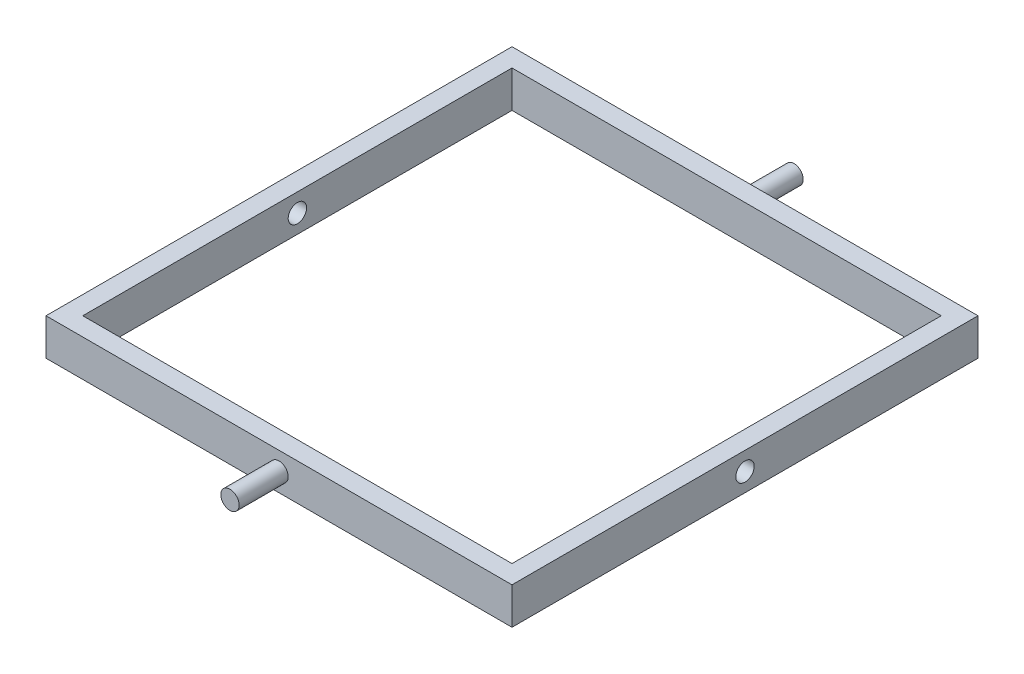
ISO-10303-21;
HEADER;
FILE_DESCRIPTION(('STEP AP214'),'2;1');
FILE_NAME('part.step','',(''),(''),'','','');
FILE_SCHEMA(('AUTOMOTIVE_DESIGN { 1 0 10303 214 1 1 1 1 }'));
ENDSEC;
DATA;
#1=APPLICATION_CONTEXT('core data for automotive mechanical design processes');
#2=APPLICATION_PROTOCOL_DEFINITION('international standard','automotive_design',2000,#1);
#3=PRODUCT_CONTEXT('',#1,'mechanical');
#4=PRODUCT('Part','Part','',(#3));
#5=PRODUCT_RELATED_PRODUCT_CATEGORY('part','',(#4));
#6=PRODUCT_DEFINITION_FORMATION('','',#4);
#7=PRODUCT_DEFINITION_CONTEXT('part definition',#1,'design');
#8=PRODUCT_DEFINITION('design','',#6,#7);
#9=PRODUCT_DEFINITION_SHAPE('','',#8);
#10=(LENGTH_UNIT() NAMED_UNIT(*) SI_UNIT(.MILLI.,.METRE.));
#11=(NAMED_UNIT(*) PLANE_ANGLE_UNIT() SI_UNIT($,.RADIAN.));
#12=(NAMED_UNIT(*) SI_UNIT($,.STERADIAN.) SOLID_ANGLE_UNIT());
#13=UNCERTAINTY_MEASURE_WITH_UNIT(LENGTH_MEASURE(1.E-05),#10,'distance_accuracy_value','');
#14=(GEOMETRIC_REPRESENTATION_CONTEXT(3) GLOBAL_UNCERTAINTY_ASSIGNED_CONTEXT((#13)) GLOBAL_UNIT_ASSIGNED_CONTEXT((#10,
#11,#12)) REPRESENTATION_CONTEXT('',''));
#15=CARTESIAN_POINT('',(0.,0.,0.));
#16=DIRECTION('',(0.,0.,1.));
#17=DIRECTION('',(1.,0.,0.));
#18=AXIS2_PLACEMENT_3D('',#15,#16,#17);
#19=CARTESIAN_POINT('',(0.,6.,0.));
#20=DIRECTION('',(0.,1.,0.));
#21=DIRECTION('',(0.,0.,1.));
#22=AXIS2_PLACEMENT_3D('',#19,#20,#21);
#23=PLANE('',#22);
#24=DIRECTION('',(0.,0.,1.));
#25=VECTOR('',#24,1.);
#26=CARTESIAN_POINT('',(-38.1929881959609,6.,0.));
#27=LINE('',#26,#25);
#28=CARTESIAN_POINT('',(-38.1929881959609,6.,-38.));
#29=VERTEX_POINT('',#28);
#30=CARTESIAN_POINT('',(-38.1929881959609,6.,38.));
#31=VERTEX_POINT('',#30);
#32=EDGE_CURVE('E160',#29,#31,#27,.T.);
#33=ORIENTED_EDGE('',*,*,#32,.T.);
#34=DIRECTION('',(1.,0.,0.));
#35=VECTOR('',#34,1.);
#36=CARTESIAN_POINT('',(0.,6.,38.));
#37=LINE('',#36,#35);
#38=CARTESIAN_POINT('',(37.8070118040392,6.,38.));
#39=VERTEX_POINT('',#38);
#40=EDGE_CURVE('E163',#31,#39,#37,.T.);
#41=ORIENTED_EDGE('',*,*,#40,.T.);
#42=DIRECTION('',(0.,0.,-1.));
#43=VECTOR('',#42,1.);
#44=CARTESIAN_POINT('',(37.8070118040391,6.,0.));
#45=LINE('',#44,#43);
#46=CARTESIAN_POINT('',(37.8070118040391,6.,-38.));
#47=VERTEX_POINT('',#46);
#48=EDGE_CURVE('E166',#39,#47,#45,.T.);
#49=ORIENTED_EDGE('',*,*,#48,.T.);
#50=DIRECTION('',(-1.,0.,0.));
#51=VECTOR('',#50,1.);
#52=CARTESIAN_POINT('',(0.,6.,-38.));
#53=LINE('',#52,#51);
#54=EDGE_CURVE('E168',#47,#29,#53,.T.);
#55=ORIENTED_EDGE('',*,*,#54,.T.);
#56=EDGE_LOOP('',(#33,#41,#49,#55));
#57=FACE_BOUND('',#56,.T.);
#58=DIRECTION('',(1.,0.,0.));
#59=VECTOR('',#58,1.);
#60=CARTESIAN_POINT('',(-35.1929881959609,6.,35.));
#61=LINE('',#60,#59);
#62=CARTESIAN_POINT('',(-35.1929881959609,6.,35.));
#63=VERTEX_POINT('',#62);
#64=CARTESIAN_POINT('',(34.8070118040392,6.,35.));
#65=VERTEX_POINT('',#64);
#66=EDGE_CURVE('E130',#63,#65,#61,.T.);
#67=ORIENTED_EDGE('',*,*,#66,.F.);
#68=DIRECTION('',(0.,0.,1.));
#69=VECTOR('',#68,1.);
#70=CARTESIAN_POINT('',(-35.1929881959609,6.,35.));
#71=LINE('',#70,#69);
#72=CARTESIAN_POINT('',(-35.1929881959609,6.,-35.));
#73=VERTEX_POINT('',#72);
#74=EDGE_CURVE('E122',#73,#63,#71,.T.);
#75=ORIENTED_EDGE('',*,*,#74,.F.);
#76=DIRECTION('',(-1.,0.,0.));
#77=VECTOR('',#76,1.);
#78=CARTESIAN_POINT('',(-35.1929881959609,6.,-35.));
#79=LINE('',#78,#77);
#80=CARTESIAN_POINT('',(34.8070118040391,6.,-35.));
#81=VERTEX_POINT('',#80);
#82=EDGE_CURVE('E144',#81,#73,#79,.T.);
#83=ORIENTED_EDGE('',*,*,#82,.F.);
#84=DIRECTION('',(0.,0.,-1.));
#85=VECTOR('',#84,1.);
#86=CARTESIAN_POINT('',(34.8070118040392,6.,35.));
#87=LINE('',#86,#85);
#88=EDGE_CURVE('E142',#65,#81,#87,.T.);
#89=ORIENTED_EDGE('',*,*,#88,.F.);
#90=EDGE_LOOP('',(#67,#75,#83,#89));
#91=FACE_BOUND('',#90,.T.);
#92=ADVANCED_FACE('F57',(#57,#91),#23,.T.);
#93=CARTESIAN_POINT('',(0.,0.,0.));
#94=DIRECTION('',(0.,1.,0.));
#95=DIRECTION('',(0.,0.,1.));
#96=AXIS2_PLACEMENT_3D('',#93,#94,#95);
#97=PLANE('',#96);
#98=DIRECTION('',(0.,0.,1.));
#99=VECTOR('',#98,1.);
#100=CARTESIAN_POINT('',(-38.1929881959609,0.,0.));
#101=LINE('',#100,#99);
#102=CARTESIAN_POINT('',(-38.1929881959609,0.,-38.));
#103=VERTEX_POINT('',#102);
#104=CARTESIAN_POINT('',(-38.1929881959609,0.,38.));
#105=VERTEX_POINT('',#104);
#106=EDGE_CURVE('E138',#103,#105,#101,.T.);
#107=ORIENTED_EDGE('',*,*,#106,.F.);
#108=DIRECTION('',(-1.,0.,0.));
#109=VECTOR('',#108,1.);
#110=CARTESIAN_POINT('',(0.,0.,-38.));
#111=LINE('',#110,#109);
#112=CARTESIAN_POINT('',(37.8070118040391,0.,-38.));
#113=VERTEX_POINT('',#112);
#114=EDGE_CURVE('E164',#113,#103,#111,.T.);
#115=ORIENTED_EDGE('',*,*,#114,.F.);
#116=DIRECTION('',(0.,0.,-1.));
#117=VECTOR('',#116,1.);
#118=CARTESIAN_POINT('',(37.8070118040391,0.,0.));
#119=LINE('',#118,#117);
#120=CARTESIAN_POINT('',(37.8070118040392,0.,38.));
#121=VERTEX_POINT('',#120);
#122=EDGE_CURVE('E175',#121,#113,#119,.T.);
#123=ORIENTED_EDGE('',*,*,#122,.F.);
#124=DIRECTION('',(1.,0.,0.));
#125=VECTOR('',#124,1.);
#126=CARTESIAN_POINT('',(0.,0.,38.));
#127=LINE('',#126,#125);
#128=EDGE_CURVE('E173',#105,#121,#127,.T.);
#129=ORIENTED_EDGE('',*,*,#128,.F.);
#130=EDGE_LOOP('',(#107,#115,#123,#129));
#131=FACE_BOUND('',#130,.T.);
#132=DIRECTION('',(0.,0.,1.));
#133=VECTOR('',#132,1.);
#134=CARTESIAN_POINT('',(-35.1929881959609,0.,35.));
#135=LINE('',#134,#133);
#136=CARTESIAN_POINT('',(-35.1929881959609,0.,-35.));
#137=VERTEX_POINT('',#136);
#138=CARTESIAN_POINT('',(-35.1929881959609,0.,35.));
#139=VERTEX_POINT('',#138);
#140=EDGE_CURVE('E80',#137,#139,#135,.T.);
#141=ORIENTED_EDGE('',*,*,#140,.T.);
#142=DIRECTION('',(1.,0.,0.));
#143=VECTOR('',#142,1.);
#144=CARTESIAN_POINT('',(-35.1929881959609,0.,35.));
#145=LINE('',#144,#143);
#146=CARTESIAN_POINT('',(34.8070118040392,0.,35.));
#147=VERTEX_POINT('',#146);
#148=EDGE_CURVE('E137',#139,#147,#145,.T.);
#149=ORIENTED_EDGE('',*,*,#148,.T.);
#150=DIRECTION('',(0.,0.,-1.));
#151=VECTOR('',#150,1.);
#152=CARTESIAN_POINT('',(34.8070118040392,0.,35.));
#153=LINE('',#152,#151);
#154=CARTESIAN_POINT('',(34.8070118040391,0.,-35.));
#155=VERTEX_POINT('',#154);
#156=EDGE_CURVE('E152',#147,#155,#153,.T.);
#157=ORIENTED_EDGE('',*,*,#156,.T.);
#158=DIRECTION('',(-1.,0.,0.));
#159=VECTOR('',#158,1.);
#160=CARTESIAN_POINT('',(-35.1929881959609,0.,-35.));
#161=LINE('',#160,#159);
#162=EDGE_CURVE('E131',#155,#137,#161,.T.);
#163=ORIENTED_EDGE('',*,*,#162,.T.);
#164=EDGE_LOOP('',(#141,#149,#157,#163));
#165=FACE_BOUND('',#164,.T.);
#166=ADVANCED_FACE('F223',(#131,#165),#97,.F.);
#167=CARTESIAN_POINT('',(-38.1929881959609,6.,0.));
#168=DIRECTION('',(1.,0.,0.));
#169=DIRECTION('',(0.,0.,-1.));
#170=AXIS2_PLACEMENT_3D('',#167,#168,#169);
#171=PLANE('',#170);
#172=CARTESIAN_POINT('',(-38.1929881959609,3.,0.));
#173=DIRECTION('',(-1.,0.,0.));
#174=DIRECTION('',(0.,0.,1.));
#175=AXIS2_PLACEMENT_3D('',#172,#173,#174);
#176=CIRCLE('',#175,1.5);
#177=CARTESIAN_POINT('',(-38.1929881959609,3.,1.50000000000003));
#178=VERTEX_POINT('',#177);
#179=EDGE_CURVE('E194',#178,#178,#176,.T.);
#180=ORIENTED_EDGE('',*,*,#179,.F.);
#181=EDGE_LOOP('',(#180));
#182=FACE_BOUND('',#181,.T.);
#183=ORIENTED_EDGE('',*,*,#106,.T.);
#184=DIRECTION('',(0.,-1.,0.));
#185=VECTOR('',#184,1.);
#186=CARTESIAN_POINT('',(-38.1929881959609,6.,38.));
#187=LINE('',#186,#185);
#188=EDGE_CURVE('E65',#31,#105,#187,.T.);
#189=ORIENTED_EDGE('',*,*,#188,.F.);
#190=ORIENTED_EDGE('',*,*,#32,.F.);
#191=DIRECTION('',(0.,-1.,0.));
#192=VECTOR('',#191,1.);
#193=CARTESIAN_POINT('',(-38.1929881959609,6.,-38.));
#194=LINE('',#193,#192);
#195=EDGE_CURVE('E170',#29,#103,#194,.T.);
#196=ORIENTED_EDGE('',*,*,#195,.T.);
#197=EDGE_LOOP('',(#183,#189,#190,#196));
#198=FACE_BOUND('',#197,.T.);
#199=ADVANCED_FACE('F59',(#182,#198),#171,.F.);
#200=CARTESIAN_POINT('',(0.,6.,38.));
#201=DIRECTION('',(0.,0.,-1.));
#202=DIRECTION('',(-1.,0.,0.));
#203=AXIS2_PLACEMENT_3D('',#200,#201,#202);
#204=PLANE('',#203);
#205=CARTESIAN_POINT('',(-0.192988195960878,3.,38.));
#206=DIRECTION('',(0.,0.,-1.));
#207=DIRECTION('',(-1.,0.,0.));
#208=AXIS2_PLACEMENT_3D('',#205,#206,#207);
#209=CIRCLE('',#208,1.5);
#210=CARTESIAN_POINT('',(-1.69298819596088,3.,38.));
#211=VERTEX_POINT('',#210);
#212=EDGE_CURVE('E205',#211,#211,#209,.T.);
#213=ORIENTED_EDGE('',*,*,#212,.T.);
#214=EDGE_LOOP('',(#213));
#215=FACE_BOUND('',#214,.T.);
#216=ORIENTED_EDGE('',*,*,#128,.T.);
#217=DIRECTION('',(0.,-1.,0.));
#218=VECTOR('',#217,1.);
#219=CARTESIAN_POINT('',(37.8070118040392,6.,38.));
#220=LINE('',#219,#218);
#221=EDGE_CURVE('E183',#39,#121,#220,.T.);
#222=ORIENTED_EDGE('',*,*,#221,.F.);
#223=ORIENTED_EDGE('',*,*,#40,.F.);
#224=ORIENTED_EDGE('',*,*,#188,.T.);
#225=EDGE_LOOP('',(#216,#222,#223,#224));
#226=FACE_BOUND('',#225,.T.);
#227=ADVANCED_FACE('F240',(#215,#226),#204,.F.);
#228=CARTESIAN_POINT('',(37.8070118040391,6.,0.));
#229=DIRECTION('',(-1.,0.,0.));
#230=DIRECTION('',(0.,0.,1.));
#231=AXIS2_PLACEMENT_3D('',#228,#229,#230);
#232=PLANE('',#231);
#233=CARTESIAN_POINT('',(37.8070118040392,3.,0.));
#234=DIRECTION('',(-1.,0.,0.));
#235=DIRECTION('',(0.,0.,1.));
#236=AXIS2_PLACEMENT_3D('',#233,#234,#235);
#237=CIRCLE('',#236,1.5);
#238=CARTESIAN_POINT('',(37.8070118040392,3.,1.5));
#239=VERTEX_POINT('',#238);
#240=EDGE_CURVE('E189',#239,#239,#237,.T.);
#241=ORIENTED_EDGE('',*,*,#240,.T.);
#242=EDGE_LOOP('',(#241));
#243=FACE_BOUND('',#242,.T.);
#244=ORIENTED_EDGE('',*,*,#122,.T.);
#245=DIRECTION('',(0.,-1.,0.));
#246=VECTOR('',#245,1.);
#247=CARTESIAN_POINT('',(37.8070118040391,6.,-38.));
#248=LINE('',#247,#246);
#249=EDGE_CURVE('E180',#47,#113,#248,.T.);
#250=ORIENTED_EDGE('',*,*,#249,.F.);
#251=ORIENTED_EDGE('',*,*,#48,.F.);
#252=ORIENTED_EDGE('',*,*,#221,.T.);
#253=EDGE_LOOP('',(#244,#250,#251,#252));
#254=FACE_BOUND('',#253,.T.);
#255=ADVANCED_FACE('F237',(#243,#254),#232,.F.);
#256=CARTESIAN_POINT('',(0.,6.,-38.));
#257=DIRECTION('',(0.,0.,1.));
#258=DIRECTION('',(1.,0.,0.));
#259=AXIS2_PLACEMENT_3D('',#256,#257,#258);
#260=PLANE('',#259);
#261=CARTESIAN_POINT('',(-0.192988195960878,3.,-38.));
#262=DIRECTION('',(0.,0.,1.));
#263=DIRECTION('',(1.,0.,0.));
#264=AXIS2_PLACEMENT_3D('',#261,#262,#263);
#265=CIRCLE('',#264,1.5);
#266=CARTESIAN_POINT('',(1.30701180403913,3.,-38.));
#267=VERTEX_POINT('',#266);
#268=EDGE_CURVE('E12',#267,#267,#265,.F.);
#269=ORIENTED_EDGE('',*,*,#268,.F.);
#270=EDGE_LOOP('',(#269));
#271=FACE_BOUND('',#270,.T.);
#272=ORIENTED_EDGE('',*,*,#114,.T.);
#273=ORIENTED_EDGE('',*,*,#195,.F.);
#274=ORIENTED_EDGE('',*,*,#54,.F.);
#275=ORIENTED_EDGE('',*,*,#249,.T.);
#276=EDGE_LOOP('',(#272,#273,#274,#275));
#277=FACE_BOUND('',#276,.T.);
#278=ADVANCED_FACE('F234',(#271,#277),#260,.F.);
#279=CARTESIAN_POINT('',(-35.1929881959609,6.,35.));
#280=DIRECTION('',(1.,0.,0.));
#281=DIRECTION('',(0.,0.,-1.));
#282=AXIS2_PLACEMENT_3D('',#279,#280,#281);
#283=PLANE('',#282);
#284=CARTESIAN_POINT('',(-35.1929881959609,3.,0.));
#285=DIRECTION('',(1.,0.,0.));
#286=DIRECTION('',(0.,0.,-1.));
#287=AXIS2_PLACEMENT_3D('',#284,#285,#286);
#288=CIRCLE('',#287,1.5);
#289=CARTESIAN_POINT('',(-35.1929881959609,3.,1.50000000000003));
#290=VERTEX_POINT('',#289);
#291=EDGE_CURVE('E150',#290,#290,#288,.T.);
#292=ORIENTED_EDGE('',*,*,#291,.F.);
#293=EDGE_LOOP('',(#292));
#294=FACE_BOUND('',#293,.T.);
#295=ORIENTED_EDGE('',*,*,#140,.F.);
#296=DIRECTION('',(0.,-1.,0.));
#297=VECTOR('',#296,1.);
#298=CARTESIAN_POINT('',(-35.1929881959609,6.,-35.));
#299=LINE('',#298,#297);
#300=EDGE_CURVE('E126',#73,#137,#299,.T.);
#301=ORIENTED_EDGE('',*,*,#300,.F.);
#302=ORIENTED_EDGE('',*,*,#74,.T.);
#303=DIRECTION('',(0.,-1.,0.));
#304=VECTOR('',#303,1.);
#305=CARTESIAN_POINT('',(-35.1929881959609,6.,35.));
#306=LINE('',#305,#304);
#307=EDGE_CURVE('E125',#63,#139,#306,.T.);
#308=ORIENTED_EDGE('',*,*,#307,.T.);
#309=EDGE_LOOP('',(#295,#301,#302,#308));
#310=FACE_BOUND('',#309,.T.);
#311=ADVANCED_FACE('F124',(#294,#310),#283,.T.);
#312=CARTESIAN_POINT('',(-35.1929881959609,6.,35.));
#313=DIRECTION('',(0.,0.,-1.));
#314=DIRECTION('',(-1.,0.,0.));
#315=AXIS2_PLACEMENT_3D('',#312,#313,#314);
#316=PLANE('',#315);
#317=ORIENTED_EDGE('',*,*,#148,.F.);
#318=ORIENTED_EDGE('',*,*,#307,.F.);
#319=ORIENTED_EDGE('',*,*,#66,.T.);
#320=DIRECTION('',(0.,-1.,0.));
#321=VECTOR('',#320,1.);
#322=CARTESIAN_POINT('',(34.8070118040392,6.,35.));
#323=LINE('',#322,#321);
#324=EDGE_CURVE('E139',#65,#147,#323,.T.);
#325=ORIENTED_EDGE('',*,*,#324,.T.);
#326=EDGE_LOOP('',(#317,#318,#319,#325));
#327=FACE_BOUND('',#326,.T.);
#328=ADVANCED_FACE('F134',(#327),#316,.T.);
#329=CARTESIAN_POINT('',(34.8070118040392,6.,35.));
#330=DIRECTION('',(-1.,0.,0.));
#331=DIRECTION('',(0.,0.,1.));
#332=AXIS2_PLACEMENT_3D('',#329,#330,#331);
#333=PLANE('',#332);
#334=CARTESIAN_POINT('',(34.8070118040391,3.,0.));
#335=DIRECTION('',(-1.,0.,0.));
#336=DIRECTION('',(0.,0.,1.));
#337=AXIS2_PLACEMENT_3D('',#334,#335,#336);
#338=CIRCLE('',#337,1.5);
#339=CARTESIAN_POINT('',(34.8070118040391,3.,1.5));
#340=VERTEX_POINT('',#339);
#341=EDGE_CURVE('E187',#340,#340,#338,.T.);
#342=ORIENTED_EDGE('',*,*,#341,.F.);
#343=EDGE_LOOP('',(#342));
#344=FACE_BOUND('',#343,.T.);
#345=ORIENTED_EDGE('',*,*,#156,.F.);
#346=ORIENTED_EDGE('',*,*,#324,.F.);
#347=ORIENTED_EDGE('',*,*,#88,.T.);
#348=DIRECTION('',(0.,-1.,0.));
#349=VECTOR('',#348,1.);
#350=CARTESIAN_POINT('',(34.8070118040391,6.,-35.));
#351=LINE('',#350,#349);
#352=EDGE_CURVE('E72',#81,#155,#351,.T.);
#353=ORIENTED_EDGE('',*,*,#352,.T.);
#354=EDGE_LOOP('',(#345,#346,#347,#353));
#355=FACE_BOUND('',#354,.T.);
#356=ADVANCED_FACE('F267',(#344,#355),#333,.T.);
#357=CARTESIAN_POINT('',(-35.1929881959609,6.,-35.));
#358=DIRECTION('',(0.,0.,1.));
#359=DIRECTION('',(1.,0.,0.));
#360=AXIS2_PLACEMENT_3D('',#357,#358,#359);
#361=PLANE('',#360);
#362=ORIENTED_EDGE('',*,*,#162,.F.);
#363=ORIENTED_EDGE('',*,*,#352,.F.);
#364=ORIENTED_EDGE('',*,*,#82,.T.);
#365=ORIENTED_EDGE('',*,*,#300,.T.);
#366=EDGE_LOOP('',(#362,#363,#364,#365));
#367=FACE_BOUND('',#366,.T.);
#368=ADVANCED_FACE('F264',(#367),#361,.T.);
#369=CARTESIAN_POINT('',(37.8070118040392,3.,0.));
#370=DIRECTION('',(-1.,0.,0.));
#371=DIRECTION('',(0.,0.,1.));
#372=AXIS2_PLACEMENT_3D('',#369,#370,#371);
#373=CYLINDRICAL_SURFACE('',#372,1.5);
#374=CARTESIAN_POINT('',(34.8070118040391,3.,1.5));
#375=CARTESIAN_POINT('',(34.8382618040391,3.,1.5));
#376=CARTESIAN_POINT('',(34.8695118040391,3.,1.5));
#377=CARTESIAN_POINT('',(34.9320118040391,3.,1.5));
#378=CARTESIAN_POINT('',(34.9632618040391,3.,1.5));
#379=CARTESIAN_POINT('',(35.0257618040391,3.,1.5));
#380=CARTESIAN_POINT('',(35.0570118040391,3.,1.5));
#381=CARTESIAN_POINT('',(35.1195118040391,3.,1.5));
#382=CARTESIAN_POINT('',(35.1507618040391,3.,1.5));
#383=CARTESIAN_POINT('',(35.2132618040391,3.,1.5));
#384=CARTESIAN_POINT('',(35.2445118040391,3.,1.5));
#385=CARTESIAN_POINT('',(35.3070118040391,3.,1.5));
#386=CARTESIAN_POINT('',(35.3382618040391,3.,1.5));
#387=CARTESIAN_POINT('',(35.4007618040391,3.,1.5));
#388=CARTESIAN_POINT('',(35.4320118040391,3.,1.5));
#389=CARTESIAN_POINT('',(35.4945118040392,3.,1.5));
#390=CARTESIAN_POINT('',(35.5257618040391,3.,1.5));
#391=CARTESIAN_POINT('',(35.5882618040391,3.,1.5));
#392=CARTESIAN_POINT('',(35.6195118040392,3.,1.5));
#393=CARTESIAN_POINT('',(35.6820118040392,3.,1.5));
#394=CARTESIAN_POINT('',(35.7132618040391,3.,1.5));
#395=CARTESIAN_POINT('',(35.7757618040391,3.,1.5));
#396=CARTESIAN_POINT('',(35.8070118040392,3.,1.5));
#397=CARTESIAN_POINT('',(35.8695118040392,3.,1.5));
#398=CARTESIAN_POINT('',(35.9007618040391,3.,1.5));
#399=CARTESIAN_POINT('',(35.9632618040392,3.,1.5));
#400=CARTESIAN_POINT('',(35.9945118040392,3.,1.5));
#401=CARTESIAN_POINT('',(36.0570118040392,3.,1.5));
#402=CARTESIAN_POINT('',(36.0882618040392,3.,1.5));
#403=CARTESIAN_POINT('',(36.1507618040392,3.,1.5));
#404=CARTESIAN_POINT('',(36.1820118040392,3.,1.5));
#405=CARTESIAN_POINT('',(36.2445118040392,3.,1.5));
#406=CARTESIAN_POINT('',(36.2757618040392,3.,1.5));
#407=CARTESIAN_POINT('',(36.3382618040392,3.,1.5));
#408=CARTESIAN_POINT('',(36.3695118040392,3.,1.5));
#409=CARTESIAN_POINT('',(36.4320118040392,3.,1.5));
#410=CARTESIAN_POINT('',(36.4632618040392,3.,1.5));
#411=CARTESIAN_POINT('',(36.5257618040392,3.,1.5));
#412=CARTESIAN_POINT('',(36.5570118040392,3.,1.5));
#413=CARTESIAN_POINT('',(36.6195118040392,3.,1.5));
#414=CARTESIAN_POINT('',(36.6507618040392,3.,1.5));
#415=CARTESIAN_POINT('',(36.7132618040392,3.,1.5));
#416=CARTESIAN_POINT('',(36.7445118040392,3.,1.5));
#417=CARTESIAN_POINT('',(36.8070118040392,3.,1.5));
#418=CARTESIAN_POINT('',(36.8382618040392,3.,1.5));
#419=CARTESIAN_POINT('',(36.9007618040392,3.,1.5));
#420=CARTESIAN_POINT('',(36.9320118040392,3.,1.5));
#421=CARTESIAN_POINT('',(36.9945118040392,3.,1.5));
#422=CARTESIAN_POINT('',(37.0257618040392,3.,1.5));
#423=CARTESIAN_POINT('',(37.0882618040392,3.,1.5));
#424=CARTESIAN_POINT('',(37.1195118040392,3.,1.5));
#425=CARTESIAN_POINT('',(37.1820118040392,3.,1.5));
#426=CARTESIAN_POINT('',(37.2132618040392,3.,1.5));
#427=CARTESIAN_POINT('',(37.2757618040392,3.,1.5));
#428=CARTESIAN_POINT('',(37.3070118040392,3.,1.5));
#429=CARTESIAN_POINT('',(37.3695118040392,3.,1.5));
#430=CARTESIAN_POINT('',(37.4007618040392,3.,1.5));
#431=CARTESIAN_POINT('',(37.4632618040392,3.,1.5));
#432=CARTESIAN_POINT('',(37.4945118040392,3.,1.5));
#433=CARTESIAN_POINT('',(37.5570118040392,3.,1.5));
#434=CARTESIAN_POINT('',(37.5882618040392,3.,1.5));
#435=CARTESIAN_POINT('',(37.6507618040392,3.,1.5));
#436=CARTESIAN_POINT('',(37.6820118040392,3.,1.5));
#437=CARTESIAN_POINT('',(37.7445118040392,3.,1.5));
#438=CARTESIAN_POINT('',(37.7757618040392,3.,1.5));
#439=CARTESIAN_POINT('',(37.8070118040392,3.,1.5));
#440=B_SPLINE_CURVE_WITH_KNOTS('',3,(#374,#375,#376,#377,#378,#379,#380,#381,#382,#383,#384,
#385,#386,#387,#388,#389,#390,#391,#392,#393,#394,#395,#396,#397,#398,#399,#400,#401,#402,#403,
#404,#405,#406,#407,#408,#409,#410,#411,#412,#413,#414,#415,#416,#417,#418,#419,#420,#421,#422,
#423,#424,#425,#426,#427,#428,#429,#430,#431,#432,#433,#434,#435,#436,#437,#438,#439),
.UNSPECIFIED.,.F.,.F.,(4,2,2,2,2,2,2,2,2,2,2,2,2,2,2,2,2,2,2,2,2,2,2,2,2,2,2,2,2,2,2,2,4),(0.,
0.0937499999999966,0.1875,0.281249999999997,0.375,0.468750000000004,0.5625,0.656250000000004,
0.750000000000008,0.843750000000004,0.937500000000008,1.03125,1.12500000000001,1.21875000000001,
1.31250000000001,1.40625000000001,1.50000000000002,1.59375000000001,1.68750000000002,
1.78125000000001,1.87500000000002,1.96875000000002,2.06250000000002,2.15625000000002,
2.25000000000002,2.34375000000002,2.43750000000002,2.53125000000002,2.62500000000002,
2.71875000000003,2.81250000000002,2.90625000000003,3.00000000000002),.UNSPECIFIED.);
#441=EDGE_CURVE('BSEAM266',#340,#239,#440,.T.);
#442=ORIENTED_EDGE('',*,*,#341,.T.);
#443=ORIENTED_EDGE('',*,*,#240,.F.);
#444=ORIENTED_EDGE('',*,*,#441,.T.);
#445=ORIENTED_EDGE('',*,*,#441,.F.);
#446=EDGE_LOOP('',(#442,#444,#443,#445));
#447=FACE_BOUND('',#446,.T.);
#448=ADVANCED_FACE('F266',(#447),#373,.F.);
#449=CARTESIAN_POINT('',(-35.1929881959609,3.,1.50000000000003));
#450=CARTESIAN_POINT('',(-35.2242381959609,3.,1.50000000000003));
#451=CARTESIAN_POINT('',(-35.2554881959609,3.,1.50000000000003));
#452=CARTESIAN_POINT('',(-35.3179881959609,3.,1.50000000000003));
#453=CARTESIAN_POINT('',(-35.3492381959609,3.,1.50000000000003));
#454=CARTESIAN_POINT('',(-35.4117381959609,3.,1.50000000000003));
#455=CARTESIAN_POINT('',(-35.4429881959609,3.,1.50000000000003));
#456=CARTESIAN_POINT('',(-35.5054881959609,3.,1.50000000000003));
#457=CARTESIAN_POINT('',(-35.5367381959609,3.,1.50000000000003));
#458=CARTESIAN_POINT('',(-35.5992381959609,3.,1.50000000000003));
#459=CARTESIAN_POINT('',(-35.6304881959609,3.,1.50000000000003));
#460=CARTESIAN_POINT('',(-35.6929881959609,3.,1.50000000000003));
#461=CARTESIAN_POINT('',(-35.7242381959609,3.,1.50000000000003));
#462=CARTESIAN_POINT('',(-35.7867381959609,3.,1.50000000000003));
#463=CARTESIAN_POINT('',(-35.8179881959609,3.,1.50000000000003));
#464=CARTESIAN_POINT('',(-35.8804881959609,3.,1.50000000000003));
#465=CARTESIAN_POINT('',(-35.9117381959609,3.,1.50000000000003));
#466=CARTESIAN_POINT('',(-35.9742381959609,3.,1.50000000000003));
#467=CARTESIAN_POINT('',(-36.0054881959609,3.,1.50000000000003));
#468=CARTESIAN_POINT('',(-36.0679881959609,3.,1.50000000000003));
#469=CARTESIAN_POINT('',(-36.0992381959609,3.,1.50000000000003));
#470=CARTESIAN_POINT('',(-36.1617381959609,3.,1.50000000000003));
#471=CARTESIAN_POINT('',(-36.1929881959609,3.,1.50000000000003));
#472=CARTESIAN_POINT('',(-36.2554881959609,3.,1.50000000000003));
#473=CARTESIAN_POINT('',(-36.2867381959609,3.,1.50000000000003));
#474=CARTESIAN_POINT('',(-36.3492381959609,3.,1.50000000000003));
#475=CARTESIAN_POINT('',(-36.3804881959609,3.,1.50000000000003));
#476=CARTESIAN_POINT('',(-36.4429881959609,3.,1.50000000000003));
#477=CARTESIAN_POINT('',(-36.4742381959609,3.,1.50000000000003));
#478=CARTESIAN_POINT('',(-36.5367381959609,3.,1.50000000000003));
#479=CARTESIAN_POINT('',(-36.5679881959609,3.,1.50000000000003));
#480=CARTESIAN_POINT('',(-36.6304881959609,3.,1.50000000000003));
#481=CARTESIAN_POINT('',(-36.6617381959609,3.,1.50000000000003));
#482=CARTESIAN_POINT('',(-36.7242381959609,3.,1.50000000000003));
#483=CARTESIAN_POINT('',(-36.7554881959609,3.,1.50000000000003));
#484=CARTESIAN_POINT('',(-36.8179881959609,3.,1.50000000000003));
#485=CARTESIAN_POINT('',(-36.8492381959609,3.,1.50000000000003));
#486=CARTESIAN_POINT('',(-36.9117381959609,3.,1.50000000000003));
#487=CARTESIAN_POINT('',(-36.9429881959609,3.,1.50000000000003));
#488=CARTESIAN_POINT('',(-37.0054881959609,3.,1.50000000000003));
#489=CARTESIAN_POINT('',(-37.0367381959609,3.,1.50000000000003));
#490=CARTESIAN_POINT('',(-37.0992381959609,3.,1.50000000000003));
#491=CARTESIAN_POINT('',(-37.1304881959609,3.,1.50000000000003));
#492=CARTESIAN_POINT('',(-37.1929881959609,3.,1.50000000000003));
#493=CARTESIAN_POINT('',(-37.2242381959609,3.,1.50000000000003));
#494=CARTESIAN_POINT('',(-37.2867381959609,3.,1.50000000000003));
#495=CARTESIAN_POINT('',(-37.3179881959609,3.,1.50000000000003));
#496=CARTESIAN_POINT('',(-37.3804881959609,3.,1.50000000000003));
#497=CARTESIAN_POINT('',(-37.4117381959609,3.,1.50000000000003));
#498=CARTESIAN_POINT('',(-37.4742381959609,3.,1.50000000000003));
#499=CARTESIAN_POINT('',(-37.5054881959609,3.,1.50000000000003));
#500=CARTESIAN_POINT('',(-37.5679881959609,3.,1.50000000000003));
#501=CARTESIAN_POINT('',(-37.5992381959609,3.,1.50000000000003));
#502=CARTESIAN_POINT('',(-37.6617381959609,3.,1.50000000000003));
#503=CARTESIAN_POINT('',(-37.6929881959609,3.,1.50000000000003));
#504=CARTESIAN_POINT('',(-37.7554881959609,3.,1.50000000000003));
#505=CARTESIAN_POINT('',(-37.7867381959609,3.,1.50000000000003));
#506=CARTESIAN_POINT('',(-37.8492381959609,3.,1.50000000000003));
#507=CARTESIAN_POINT('',(-37.8804881959609,3.,1.50000000000003));
#508=CARTESIAN_POINT('',(-37.9429881959609,3.,1.50000000000003));
#509=CARTESIAN_POINT('',(-37.9742381959609,3.,1.50000000000003));
#510=CARTESIAN_POINT('',(-38.0367381959609,3.,1.50000000000003));
#511=CARTESIAN_POINT('',(-38.0679881959609,3.,1.50000000000003));
#512=CARTESIAN_POINT('',(-38.1304881959609,3.,1.50000000000003));
#513=CARTESIAN_POINT('',(-38.1617381959609,3.,1.50000000000003));
#514=CARTESIAN_POINT('',(-38.1929881959609,3.,1.50000000000003));
#515=B_SPLINE_CURVE_WITH_KNOTS('',3,(#449,#450,#451,#452,#453,#454,#455,#456,#457,#458,#459,
#460,#461,#462,#463,#464,#465,#466,#467,#468,#469,#470,#471,#472,#473,#474,#475,#476,#477,#478,
#479,#480,#481,#482,#483,#484,#485,#486,#487,#488,#489,#490,#491,#492,#493,#494,#495,#496,#497,
#498,#499,#500,#501,#502,#503,#504,#505,#506,#507,#508,#509,#510,#511,#512,#513,#514),
.UNSPECIFIED.,.F.,.F.,(4,2,2,2,2,2,2,2,2,2,2,2,2,2,2,2,2,2,2,2,2,2,2,2,2,2,2,2,2,2,2,2,4),(0.,
0.0937500000000036,0.187500000000007,0.281249999999997,0.375,0.468750000000004,
0.562499999999994,0.656249999999997,0.750000000000001,0.843750000000004,0.937500000000008,
1.03125,1.125,1.21875,1.31249999999999,1.40625,1.5,1.59375,1.68750000000001,1.78125,1.875,
1.96875000000001,2.06249999999999,2.15625,2.25,2.34375000000001,2.43750000000001,2.53125,2.625,
2.71875000000001,2.8125,2.90625,3.),.UNSPECIFIED.);
#516=EDGE_CURVE('BSEAM273',#290,#178,#515,.T.);
#517=ORIENTED_EDGE('',*,*,#291,.T.);
#518=ORIENTED_EDGE('',*,*,#179,.T.);
#519=ORIENTED_EDGE('',*,*,#516,.T.);
#520=ORIENTED_EDGE('',*,*,#516,.F.);
#521=EDGE_LOOP('',(#517,#519,#518,#520));
#522=FACE_BOUND('',#521,.T.);
#523=ADVANCED_FACE('F273',(#522),#373,.F.);
#524=CARTESIAN_POINT('',(-0.192988195960878,3.,-46.));
#525=DIRECTION('',(0.,0.,1.));
#526=DIRECTION('',(1.,0.,0.));
#527=AXIS2_PLACEMENT_3D('',#524,#525,#526);
#528=CYLINDRICAL_SURFACE('',#527,1.5);
#529=CARTESIAN_POINT('',(-0.192988195960878,3.,-46.));
#530=DIRECTION('',(0.,0.,-1.));
#531=DIRECTION('',(-1.,0.,0.));
#532=AXIS2_PLACEMENT_3D('',#529,#530,#531);
#533=CIRCLE('',#532,1.5);
#534=CARTESIAN_POINT('',(-1.69298819596088,3.,-46.));
#535=VERTEX_POINT('',#534);
#536=EDGE_CURVE('E199',#535,#535,#533,.T.);
#537=ORIENTED_EDGE('',*,*,#536,.F.);
#538=EDGE_LOOP('',(#537));
#539=FACE_BOUND('',#538,.T.);
#540=ORIENTED_EDGE('',*,*,#268,.T.);
#541=EDGE_LOOP('',(#540));
#542=FACE_BOUND('',#541,.T.);
#543=ADVANCED_FACE('F289',(#539,#542),#528,.T.);
#544=CARTESIAN_POINT('',(-0.192988195960878,3.,-46.));
#545=DIRECTION('',(0.,0.,-1.));
#546=DIRECTION('',(-1.,0.,0.));
#547=AXIS2_PLACEMENT_3D('',#544,#545,#546);
#548=PLANE('',#547);
#549=ORIENTED_EDGE('',*,*,#536,.T.);
#550=EDGE_LOOP('',(#549));
#551=FACE_BOUND('',#550,.T.);
#552=ADVANCED_FACE('F220',(#551),#548,.T.);
#553=CARTESIAN_POINT('',(-0.192988195960878,3.,46.));
#554=DIRECTION('',(0.,0.,-1.));
#555=DIRECTION('',(-1.,0.,0.));
#556=AXIS2_PLACEMENT_3D('',#553,#554,#555);
#557=CYLINDRICAL_SURFACE('',#556,1.5);
#558=CARTESIAN_POINT('',(-0.192988195960878,3.,46.));
#559=DIRECTION('',(0.,0.,-1.));
#560=DIRECTION('',(-1.,0.,0.));
#561=AXIS2_PLACEMENT_3D('',#558,#559,#560);
#562=CIRCLE('',#561,1.5);
#563=CARTESIAN_POINT('',(-1.69298819596088,3.,46.));
#564=VERTEX_POINT('',#563);
#565=EDGE_CURVE('E204',#564,#564,#562,.T.);
#566=ORIENTED_EDGE('',*,*,#565,.T.);
#567=EDGE_LOOP('',(#566));
#568=FACE_BOUND('',#567,.T.);
#569=ORIENTED_EDGE('',*,*,#212,.F.);
#570=EDGE_LOOP('',(#569));
#571=FACE_BOUND('',#570,.T.);
#572=ADVANCED_FACE('F211',(#568,#571),#557,.T.);
#573=CARTESIAN_POINT('',(-0.192988195960878,3.,46.));
#574=DIRECTION('',(0.,0.,1.));
#575=DIRECTION('',(-1.,0.,0.));
#576=AXIS2_PLACEMENT_3D('',#573,#574,#575);
#577=PLANE('',#576);
#578=ORIENTED_EDGE('',*,*,#565,.F.);
#579=EDGE_LOOP('',(#578));
#580=FACE_BOUND('',#579,.T.);
#581=ADVANCED_FACE('F214',(#580),#577,.T.);
#582=CLOSED_SHELL('',(#92,#166,#199,#227,#255,#278,#311,#328,#356,#368,#448,#523,#543,#552,#572,#581));
#583=MANIFOLD_SOLID_BREP('B2',#582);
#584=ADVANCED_BREP_SHAPE_REPRESENTATION('',(#18,#583),#14);
#585=SHAPE_DEFINITION_REPRESENTATION(#9,#584);
ENDSEC;
END-ISO-10303-21;
